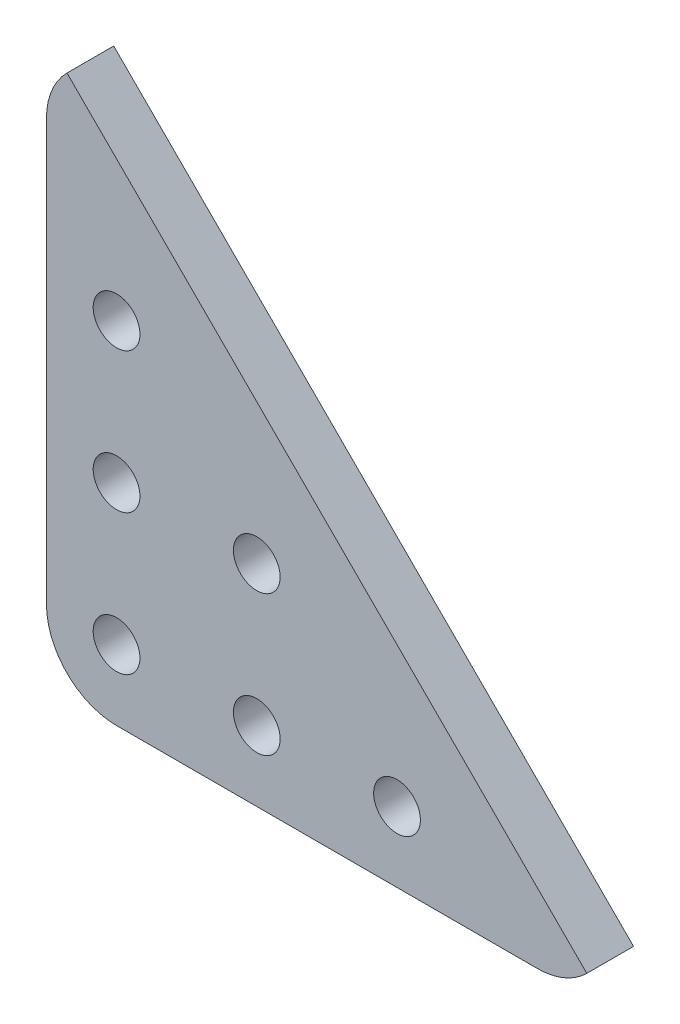
ISO-10303-21;
HEADER;
FILE_DESCRIPTION(('STEP AP214'),'2;1');
FILE_NAME('part.step','',(''),(''),'','','');
FILE_SCHEMA(('AUTOMOTIVE_DESIGN { 1 0 10303 214 1 1 1 1 }'));
ENDSEC;
DATA;
#1=APPLICATION_CONTEXT('core data for automotive mechanical design processes');
#2=APPLICATION_PROTOCOL_DEFINITION('international standard','automotive_design',2000,#1);
#3=PRODUCT_CONTEXT('',#1,'mechanical');
#4=PRODUCT('Part','Part','',(#3));
#5=PRODUCT_RELATED_PRODUCT_CATEGORY('part','',(#4));
#6=PRODUCT_DEFINITION_FORMATION('','',#4);
#7=PRODUCT_DEFINITION_CONTEXT('part definition',#1,'design');
#8=PRODUCT_DEFINITION('design','',#6,#7);
#9=PRODUCT_DEFINITION_SHAPE('','',#8);
#10=(LENGTH_UNIT() NAMED_UNIT(*) SI_UNIT(.MILLI.,.METRE.));
#11=(NAMED_UNIT(*) PLANE_ANGLE_UNIT() SI_UNIT($,.RADIAN.));
#12=(NAMED_UNIT(*) SI_UNIT($,.STERADIAN.) SOLID_ANGLE_UNIT());
#13=UNCERTAINTY_MEASURE_WITH_UNIT(LENGTH_MEASURE(1.E-05),#10,'distance_accuracy_value','');
#14=(GEOMETRIC_REPRESENTATION_CONTEXT(3) GLOBAL_UNCERTAINTY_ASSIGNED_CONTEXT((#13)) GLOBAL_UNIT_ASSIGNED_CONTEXT((#10,
#11,#12)) REPRESENTATION_CONTEXT('',''));
#15=CARTESIAN_POINT('',(0.,0.,0.));
#16=DIRECTION('',(0.,0.,1.));
#17=DIRECTION('',(1.,0.,0.));
#18=AXIS2_PLACEMENT_3D('',#15,#16,#17);
#19=CARTESIAN_POINT('',(-101.443383637,101.056539337921,3.));
#20=DIRECTION('',(0.,0.,1.));
#21=DIRECTION('',(1.,0.,0.));
#22=AXIS2_PLACEMENT_3D('',#19,#20,#21);
#23=PLANE('',#22);
#24=CARTESIAN_POINT('',(-92.443383637,74.056539338,3.));
#25=DIRECTION('',(0.,0.,1.));
#26=DIRECTION('',(1.,0.,0.));
#27=AXIS2_PLACEMENT_3D('',#24,#25,#26);
#28=CIRCLE('',#27,1.5);
#29=CARTESIAN_POINT('',(-90.943383637,74.056539338,3.));
#30=VERTEX_POINT('',#29);
#31=EDGE_CURVE('E198',#30,#30,#28,.T.);
#32=ORIENTED_EDGE('',*,*,#31,.F.);
#33=EDGE_LOOP('',(#32));
#34=FACE_BOUND('',#33,.T.);
#35=CARTESIAN_POINT('',(-92.443383637,83.056539338,3.));
#36=DIRECTION('',(0.,0.,1.));
#37=DIRECTION('',(1.,0.,0.));
#38=AXIS2_PLACEMENT_3D('',#35,#36,#37);
#39=CIRCLE('',#38,1.5);
#40=CARTESIAN_POINT('',(-90.943383637,83.056539338,3.));
#41=VERTEX_POINT('',#40);
#42=EDGE_CURVE('E210',#41,#41,#39,.T.);
#43=ORIENTED_EDGE('',*,*,#42,.F.);
#44=EDGE_LOOP('',(#43));
#45=FACE_BOUND('',#44,.T.);
#46=CARTESIAN_POINT('',(-101.443383637,92.056539338,3.));
#47=DIRECTION('',(0.,0.,1.));
#48=DIRECTION('',(1.,0.,0.));
#49=AXIS2_PLACEMENT_3D('',#46,#47,#48);
#50=CIRCLE('',#49,1.5);
#51=CARTESIAN_POINT('',(-99.943383637,92.056539338,3.));
#52=VERTEX_POINT('',#51);
#53=EDGE_CURVE('E122',#52,#52,#50,.T.);
#54=ORIENTED_EDGE('',*,*,#53,.F.);
#55=EDGE_LOOP('',(#54));
#56=FACE_BOUND('',#55,.T.);
#57=CARTESIAN_POINT('',(-101.443383637,101.056539337921,3.));
#58=DIRECTION('',(0.,0.,1.));
#59=DIRECTION('',(1.,0.,0.));
#60=AXIS2_PLACEMENT_3D('',#57,#58,#59);
#61=CIRCLE('',#60,4.50000000000001);
#62=CARTESIAN_POINT('',(-104.6253641523,104.2385198533,3.));
#63=VERTEX_POINT('',#62);
#64=CARTESIAN_POINT('',(-105.943383637,101.056539338,3.));
#65=VERTEX_POINT('',#64);
#66=EDGE_CURVE('E129',#63,#65,#61,.T.);
#67=ORIENTED_EDGE('',*,*,#66,.T.);
#68=DIRECTION('',(0.,-1.,0.));
#69=VECTOR('',#68,1.);
#70=CARTESIAN_POINT('',(-105.943383637,101.056539338,3.));
#71=LINE('',#70,#69);
#72=CARTESIAN_POINT('',(-105.943383637,74.056539338,3.));
#73=VERTEX_POINT('',#72);
#74=EDGE_CURVE('E87',#65,#73,#71,.T.);
#75=ORIENTED_EDGE('',*,*,#74,.T.);
#76=CARTESIAN_POINT('',(-101.443383637,74.056539338,3.));
#77=DIRECTION('',(0.,0.,1.));
#78=DIRECTION('',(1.,0.,0.));
#79=AXIS2_PLACEMENT_3D('',#76,#77,#78);
#80=CIRCLE('',#79,4.5);
#81=CARTESIAN_POINT('',(-101.443383637,69.556539338,3.));
#82=VERTEX_POINT('',#81);
#83=EDGE_CURVE('E100',#73,#82,#80,.T.);
#84=ORIENTED_EDGE('',*,*,#83,.T.);
#85=DIRECTION('',(1.,0.,0.));
#86=VECTOR('',#85,1.);
#87=CARTESIAN_POINT('',(-101.443383637,69.556539338,3.));
#88=LINE('',#87,#86);
#89=CARTESIAN_POINT('',(-74.443383637,69.556539338,3.));
#90=VERTEX_POINT('',#89);
#91=EDGE_CURVE('E94',#82,#90,#88,.T.);
#92=ORIENTED_EDGE('',*,*,#91,.T.);
#93=CARTESIAN_POINT('',(-74.4433836370789,74.056539338,3.));
#94=DIRECTION('',(0.,0.,1.));
#95=DIRECTION('',(1.,0.,0.));
#96=AXIS2_PLACEMENT_3D('',#93,#94,#95);
#97=CIRCLE('',#96,4.5);
#98=CARTESIAN_POINT('',(-71.2614031217,70.8745588227,3.));
#99=VERTEX_POINT('',#98);
#100=EDGE_CURVE('E98',#90,#99,#97,.T.);
#101=ORIENTED_EDGE('',*,*,#100,.T.);
#102=DIRECTION('',(-0.707106781186547,0.707106781186548,0.));
#103=VECTOR('',#102,1.);
#104=CARTESIAN_POINT('',(-104.6253641523,104.2385198533,3.));
#105=LINE('',#104,#103);
#106=EDGE_CURVE('E50',#99,#63,#105,.T.);
#107=ORIENTED_EDGE('',*,*,#106,.T.);
#108=EDGE_LOOP('',(#67,#75,#84,#92,#101,#107));
#109=FACE_BOUND('',#108,.T.);
#110=CARTESIAN_POINT('',(-101.443383637,83.056539338,3.));
#111=DIRECTION('',(0.,0.,1.));
#112=DIRECTION('',(1.,0.,0.));
#113=AXIS2_PLACEMENT_3D('',#110,#111,#112);
#114=CIRCLE('',#113,1.5);
#115=CARTESIAN_POINT('',(-99.943383637,83.056539338,3.));
#116=VERTEX_POINT('',#115);
#117=EDGE_CURVE('E216',#116,#116,#114,.T.);
#118=ORIENTED_EDGE('',*,*,#117,.F.);
#119=EDGE_LOOP('',(#118));
#120=FACE_BOUND('',#119,.T.);
#121=CARTESIAN_POINT('',(-101.443383637,74.056539338,3.));
#122=DIRECTION('',(0.,0.,1.));
#123=DIRECTION('',(1.,0.,0.));
#124=AXIS2_PLACEMENT_3D('',#121,#122,#123);
#125=CIRCLE('',#124,1.5);
#126=CARTESIAN_POINT('',(-99.943383637,74.056539338,3.));
#127=VERTEX_POINT('',#126);
#128=EDGE_CURVE('E204',#127,#127,#125,.T.);
#129=ORIENTED_EDGE('',*,*,#128,.F.);
#130=EDGE_LOOP('',(#129));
#131=FACE_BOUND('',#130,.T.);
#132=CARTESIAN_POINT('',(-83.443383637,74.056539338,3.));
#133=DIRECTION('',(0.,0.,1.));
#134=DIRECTION('',(1.,0.,0.));
#135=AXIS2_PLACEMENT_3D('',#132,#133,#134);
#136=CIRCLE('',#135,1.5);
#137=CARTESIAN_POINT('',(-81.943383637,74.056539338,3.));
#138=VERTEX_POINT('',#137);
#139=EDGE_CURVE('E189',#138,#138,#136,.T.);
#140=ORIENTED_EDGE('',*,*,#139,.F.);
#141=EDGE_LOOP('',(#140));
#142=FACE_BOUND('',#141,.T.);
#143=ADVANCED_FACE('F33',(#34,#45,#56,#109,#120,#131,#142),#23,.T.);
#144=CARTESIAN_POINT('',(-101.443383637,101.056539337921,0.));
#145=DIRECTION('',(0.,0.,1.));
#146=DIRECTION('',(1.,0.,0.));
#147=AXIS2_PLACEMENT_3D('',#144,#145,#146);
#148=PLANE('',#147);
#149=CARTESIAN_POINT('',(-92.443383637,74.056539338,0.));
#150=DIRECTION('',(0.,0.,1.));
#151=DIRECTION('',(1.,0.,0.));
#152=AXIS2_PLACEMENT_3D('',#149,#150,#151);
#153=CIRCLE('',#152,1.5);
#154=CARTESIAN_POINT('',(-90.943383637,74.056539338,0.));
#155=VERTEX_POINT('',#154);
#156=EDGE_CURVE('E195',#155,#155,#153,.T.);
#157=ORIENTED_EDGE('',*,*,#156,.T.);
#158=EDGE_LOOP('',(#157));
#159=FACE_BOUND('',#158,.T.);
#160=CARTESIAN_POINT('',(-92.443383637,83.056539338,0.));
#161=DIRECTION('',(0.,0.,1.));
#162=DIRECTION('',(1.,0.,0.));
#163=AXIS2_PLACEMENT_3D('',#160,#161,#162);
#164=CIRCLE('',#163,1.5);
#165=CARTESIAN_POINT('',(-90.943383637,83.056539338,0.));
#166=VERTEX_POINT('',#165);
#167=EDGE_CURVE('E207',#166,#166,#164,.T.);
#168=ORIENTED_EDGE('',*,*,#167,.T.);
#169=EDGE_LOOP('',(#168));
#170=FACE_BOUND('',#169,.T.);
#171=CARTESIAN_POINT('',(-101.443383637,92.056539338,0.));
#172=DIRECTION('',(0.,0.,1.));
#173=DIRECTION('',(1.,0.,0.));
#174=AXIS2_PLACEMENT_3D('',#171,#172,#173);
#175=CIRCLE('',#174,1.5);
#176=CARTESIAN_POINT('',(-99.943383637,92.056539338,0.));
#177=VERTEX_POINT('',#176);
#178=EDGE_CURVE('E219',#177,#177,#175,.T.);
#179=ORIENTED_EDGE('',*,*,#178,.T.);
#180=EDGE_LOOP('',(#179));
#181=FACE_BOUND('',#180,.T.);
#182=CARTESIAN_POINT('',(-101.443383637,101.056539337921,0.));
#183=DIRECTION('',(0.,0.,1.));
#184=DIRECTION('',(1.,0.,0.));
#185=AXIS2_PLACEMENT_3D('',#182,#183,#184);
#186=CIRCLE('',#185,4.50000000000001);
#187=CARTESIAN_POINT('',(-104.6253641523,104.2385198533,0.));
#188=VERTEX_POINT('',#187);
#189=CARTESIAN_POINT('',(-105.943383637,101.056539338,0.));
#190=VERTEX_POINT('',#189);
#191=EDGE_CURVE('E118',#188,#190,#186,.T.);
#192=ORIENTED_EDGE('',*,*,#191,.F.);
#193=DIRECTION('',(-0.707106781186547,0.707106781186548,0.));
#194=VECTOR('',#193,1.);
#195=CARTESIAN_POINT('',(-104.6253641523,104.2385198533,0.));
#196=LINE('',#195,#194);
#197=CARTESIAN_POINT('',(-71.2614031217,70.8745588227,0.));
#198=VERTEX_POINT('',#197);
#199=EDGE_CURVE('E79',#198,#188,#196,.T.);
#200=ORIENTED_EDGE('',*,*,#199,.F.);
#201=CARTESIAN_POINT('',(-74.4433836370789,74.056539338,0.));
#202=DIRECTION('',(0.,0.,1.));
#203=DIRECTION('',(1.,0.,0.));
#204=AXIS2_PLACEMENT_3D('',#201,#202,#203);
#205=CIRCLE('',#204,4.5);
#206=CARTESIAN_POINT('',(-74.443383637,69.556539338,0.));
#207=VERTEX_POINT('',#206);
#208=EDGE_CURVE('E73',#207,#198,#205,.T.);
#209=ORIENTED_EDGE('',*,*,#208,.F.);
#210=DIRECTION('',(1.,0.,0.));
#211=VECTOR('',#210,1.);
#212=CARTESIAN_POINT('',(-101.443383637,69.556539338,0.));
#213=LINE('',#212,#211);
#214=CARTESIAN_POINT('',(-101.443383637,69.556539338,0.));
#215=VERTEX_POINT('',#214);
#216=EDGE_CURVE('E108',#215,#207,#213,.T.);
#217=ORIENTED_EDGE('',*,*,#216,.F.);
#218=CARTESIAN_POINT('',(-101.443383637,74.056539338,0.));
#219=DIRECTION('',(0.,0.,1.));
#220=DIRECTION('',(1.,0.,0.));
#221=AXIS2_PLACEMENT_3D('',#218,#219,#220);
#222=CIRCLE('',#221,4.5);
#223=CARTESIAN_POINT('',(-105.943383637,74.056539338,0.));
#224=VERTEX_POINT('',#223);
#225=EDGE_CURVE('E124',#224,#215,#222,.T.);
#226=ORIENTED_EDGE('',*,*,#225,.F.);
#227=DIRECTION('',(0.,-1.,0.));
#228=VECTOR('',#227,1.);
#229=CARTESIAN_POINT('',(-105.943383637,101.056539338,0.));
#230=LINE('',#229,#228);
#231=EDGE_CURVE('E121',#190,#224,#230,.T.);
#232=ORIENTED_EDGE('',*,*,#231,.F.);
#233=EDGE_LOOP('',(#192,#200,#209,#217,#226,#232));
#234=FACE_BOUND('',#233,.T.);
#235=CARTESIAN_POINT('',(-101.443383637,83.056539338,0.));
#236=DIRECTION('',(0.,0.,1.));
#237=DIRECTION('',(1.,0.,0.));
#238=AXIS2_PLACEMENT_3D('',#235,#236,#237);
#239=CIRCLE('',#238,1.5);
#240=CARTESIAN_POINT('',(-99.943383637,83.056539338,0.));
#241=VERTEX_POINT('',#240);
#242=EDGE_CURVE('E213',#241,#241,#239,.T.);
#243=ORIENTED_EDGE('',*,*,#242,.T.);
#244=EDGE_LOOP('',(#243));
#245=FACE_BOUND('',#244,.T.);
#246=CARTESIAN_POINT('',(-101.443383637,74.056539338,0.));
#247=DIRECTION('',(0.,0.,1.));
#248=DIRECTION('',(1.,0.,0.));
#249=AXIS2_PLACEMENT_3D('',#246,#247,#248);
#250=CIRCLE('',#249,1.5);
#251=CARTESIAN_POINT('',(-99.943383637,74.056539338,0.));
#252=VERTEX_POINT('',#251);
#253=EDGE_CURVE('E201',#252,#252,#250,.T.);
#254=ORIENTED_EDGE('',*,*,#253,.T.);
#255=EDGE_LOOP('',(#254));
#256=FACE_BOUND('',#255,.T.);
#257=CARTESIAN_POINT('',(-83.443383637,74.056539338,0.));
#258=DIRECTION('',(0.,0.,1.));
#259=DIRECTION('',(1.,0.,0.));
#260=AXIS2_PLACEMENT_3D('',#257,#258,#259);
#261=CIRCLE('',#260,1.5);
#262=CARTESIAN_POINT('',(-81.943383637,74.056539338,0.));
#263=VERTEX_POINT('',#262);
#264=EDGE_CURVE('E192',#263,#263,#261,.T.);
#265=ORIENTED_EDGE('',*,*,#264,.T.);
#266=EDGE_LOOP('',(#265));
#267=FACE_BOUND('',#266,.T.);
#268=ADVANCED_FACE('F138',(#159,#170,#181,#234,#245,#256,#267),#148,.F.);
#269=CARTESIAN_POINT('',(-101.443383637,101.056539337921,3.));
#270=DIRECTION('',(0.,0.,-1.));
#271=DIRECTION('',(-1.,0.,0.));
#272=AXIS2_PLACEMENT_3D('',#269,#270,#271);
#273=CYLINDRICAL_SURFACE('',#272,4.50000000000001);
#274=ORIENTED_EDGE('',*,*,#191,.T.);
#275=DIRECTION('',(0.,0.,-1.));
#276=VECTOR('',#275,1.);
#277=CARTESIAN_POINT('',(-105.943383637,101.056539338,3.));
#278=LINE('',#277,#276);
#279=EDGE_CURVE('E11',#65,#190,#278,.T.);
#280=ORIENTED_EDGE('',*,*,#279,.F.);
#281=ORIENTED_EDGE('',*,*,#66,.F.);
#282=DIRECTION('',(0.,0.,-1.));
#283=VECTOR('',#282,1.);
#284=CARTESIAN_POINT('',(-104.6253641523,104.2385198533,3.));
#285=LINE('',#284,#283);
#286=EDGE_CURVE('E114',#63,#188,#285,.T.);
#287=ORIENTED_EDGE('',*,*,#286,.T.);
#288=EDGE_LOOP('',(#274,#280,#281,#287));
#289=FACE_BOUND('',#288,.T.);
#290=ADVANCED_FACE('F35',(#289),#273,.T.);
#291=CARTESIAN_POINT('',(-105.943383637,101.056539338,3.));
#292=DIRECTION('',(1.,0.,0.));
#293=DIRECTION('',(0.,0.,-1.));
#294=AXIS2_PLACEMENT_3D('',#291,#292,#293);
#295=PLANE('',#294);
#296=ORIENTED_EDGE('',*,*,#231,.T.);
#297=DIRECTION('',(0.,0.,-1.));
#298=VECTOR('',#297,1.);
#299=CARTESIAN_POINT('',(-105.943383637,74.056539338,3.));
#300=LINE('',#299,#298);
#301=EDGE_CURVE('E42',#73,#224,#300,.T.);
#302=ORIENTED_EDGE('',*,*,#301,.F.);
#303=ORIENTED_EDGE('',*,*,#74,.F.);
#304=ORIENTED_EDGE('',*,*,#279,.T.);
#305=EDGE_LOOP('',(#296,#302,#303,#304));
#306=FACE_BOUND('',#305,.T.);
#307=ADVANCED_FACE('F294',(#306),#295,.F.);
#308=CARTESIAN_POINT('',(-101.443383637,74.056539338,3.));
#309=DIRECTION('',(0.,0.,-1.));
#310=DIRECTION('',(-1.,0.,0.));
#311=AXIS2_PLACEMENT_3D('',#308,#309,#310);
#312=CYLINDRICAL_SURFACE('',#311,4.5);
#313=ORIENTED_EDGE('',*,*,#225,.T.);
#314=DIRECTION('',(0.,0.,-1.));
#315=VECTOR('',#314,1.);
#316=CARTESIAN_POINT('',(-101.443383637,69.556539338,3.));
#317=LINE('',#316,#315);
#318=EDGE_CURVE('E109',#82,#215,#317,.T.);
#319=ORIENTED_EDGE('',*,*,#318,.F.);
#320=ORIENTED_EDGE('',*,*,#83,.F.);
#321=ORIENTED_EDGE('',*,*,#301,.T.);
#322=EDGE_LOOP('',(#313,#319,#320,#321));
#323=FACE_BOUND('',#322,.T.);
#324=ADVANCED_FACE('F135',(#323),#312,.T.);
#325=CARTESIAN_POINT('',(-101.443383637,69.556539338,3.));
#326=DIRECTION('',(0.,1.,0.));
#327=DIRECTION('',(0.,0.,1.));
#328=AXIS2_PLACEMENT_3D('',#325,#326,#327);
#329=PLANE('',#328);
#330=ORIENTED_EDGE('',*,*,#216,.T.);
#331=DIRECTION('',(0.,0.,-1.));
#332=VECTOR('',#331,1.);
#333=CARTESIAN_POINT('',(-74.443383637,69.556539338,3.));
#334=LINE('',#333,#332);
#335=EDGE_CURVE('E105',#90,#207,#334,.T.);
#336=ORIENTED_EDGE('',*,*,#335,.F.);
#337=ORIENTED_EDGE('',*,*,#91,.F.);
#338=ORIENTED_EDGE('',*,*,#318,.T.);
#339=EDGE_LOOP('',(#330,#336,#337,#338));
#340=FACE_BOUND('',#339,.T.);
#341=ADVANCED_FACE('F106',(#340),#329,.F.);
#342=CARTESIAN_POINT('',(-74.4433836370789,74.056539338,3.));
#343=DIRECTION('',(0.,0.,-1.));
#344=DIRECTION('',(-1.,0.,0.));
#345=AXIS2_PLACEMENT_3D('',#342,#343,#344);
#346=CYLINDRICAL_SURFACE('',#345,4.5);
#347=ORIENTED_EDGE('',*,*,#208,.T.);
#348=DIRECTION('',(0.,0.,-1.));
#349=VECTOR('',#348,1.);
#350=CARTESIAN_POINT('',(-71.2614031217,70.8745588227,3.));
#351=LINE('',#350,#349);
#352=EDGE_CURVE('E110',#99,#198,#351,.T.);
#353=ORIENTED_EDGE('',*,*,#352,.F.);
#354=ORIENTED_EDGE('',*,*,#100,.F.);
#355=ORIENTED_EDGE('',*,*,#335,.T.);
#356=EDGE_LOOP('',(#347,#353,#354,#355));
#357=FACE_BOUND('',#356,.T.);
#358=ADVANCED_FACE('F112',(#357),#346,.T.);
#359=CARTESIAN_POINT('',(-104.6253641523,104.2385198533,3.));
#360=DIRECTION('',(-0.707106781186548,-0.707106781186547,0.));
#361=DIRECTION('',(0.707106781186547,-0.707106781186548,0.));
#362=AXIS2_PLACEMENT_3D('',#359,#360,#361);
#363=PLANE('',#362);
#364=ORIENTED_EDGE('',*,*,#199,.T.);
#365=ORIENTED_EDGE('',*,*,#286,.F.);
#366=ORIENTED_EDGE('',*,*,#106,.F.);
#367=ORIENTED_EDGE('',*,*,#352,.T.);
#368=EDGE_LOOP('',(#364,#365,#366,#367));
#369=FACE_BOUND('',#368,.T.);
#370=ADVANCED_FACE('F143',(#369),#363,.F.);
#371=CARTESIAN_POINT('',(-101.443383637,92.056539338,3.));
#372=DIRECTION('',(0.,0.,-1.));
#373=DIRECTION('',(-1.,0.,0.));
#374=AXIS2_PLACEMENT_3D('',#371,#372,#373);
#375=CYLINDRICAL_SURFACE('',#374,1.5);
#376=ORIENTED_EDGE('',*,*,#53,.T.);
#377=EDGE_LOOP('',(#376));
#378=FACE_BOUND('',#377,.T.);
#379=ORIENTED_EDGE('',*,*,#178,.F.);
#380=EDGE_LOOP('',(#379));
#381=FACE_BOUND('',#380,.T.);
#382=ADVANCED_FACE('F145',(#378,#381),#375,.F.);
#383=CARTESIAN_POINT('',(-101.443383637,83.056539338,3.));
#384=DIRECTION('',(0.,0.,-1.));
#385=DIRECTION('',(-1.,0.,0.));
#386=AXIS2_PLACEMENT_3D('',#383,#384,#385);
#387=CYLINDRICAL_SURFACE('',#386,1.5);
#388=ORIENTED_EDGE('',*,*,#117,.T.);
#389=EDGE_LOOP('',(#388));
#390=FACE_BOUND('',#389,.T.);
#391=ORIENTED_EDGE('',*,*,#242,.F.);
#392=EDGE_LOOP('',(#391));
#393=FACE_BOUND('',#392,.T.);
#394=ADVANCED_FACE('F151',(#390,#393),#387,.F.);
#395=CARTESIAN_POINT('',(-92.443383637,83.056539338,3.));
#396=DIRECTION('',(0.,0.,-1.));
#397=DIRECTION('',(-1.,0.,0.));
#398=AXIS2_PLACEMENT_3D('',#395,#396,#397);
#399=CYLINDRICAL_SURFACE('',#398,1.5);
#400=ORIENTED_EDGE('',*,*,#42,.T.);
#401=EDGE_LOOP('',(#400));
#402=FACE_BOUND('',#401,.T.);
#403=ORIENTED_EDGE('',*,*,#167,.F.);
#404=EDGE_LOOP('',(#403));
#405=FACE_BOUND('',#404,.T.);
#406=ADVANCED_FACE('F168',(#402,#405),#399,.F.);
#407=CARTESIAN_POINT('',(-101.443383637,74.056539338,3.));
#408=DIRECTION('',(0.,0.,-1.));
#409=DIRECTION('',(-1.,0.,0.));
#410=AXIS2_PLACEMENT_3D('',#407,#408,#409);
#411=CYLINDRICAL_SURFACE('',#410,1.5);
#412=ORIENTED_EDGE('',*,*,#128,.T.);
#413=EDGE_LOOP('',(#412));
#414=FACE_BOUND('',#413,.T.);
#415=ORIENTED_EDGE('',*,*,#253,.F.);
#416=EDGE_LOOP('',(#415));
#417=FACE_BOUND('',#416,.T.);
#418=ADVANCED_FACE('F172',(#414,#417),#411,.F.);
#419=CARTESIAN_POINT('',(-92.443383637,74.056539338,3.));
#420=DIRECTION('',(0.,0.,-1.));
#421=DIRECTION('',(-1.,0.,0.));
#422=AXIS2_PLACEMENT_3D('',#419,#420,#421);
#423=CYLINDRICAL_SURFACE('',#422,1.5);
#424=ORIENTED_EDGE('',*,*,#31,.T.);
#425=EDGE_LOOP('',(#424));
#426=FACE_BOUND('',#425,.T.);
#427=ORIENTED_EDGE('',*,*,#156,.F.);
#428=EDGE_LOOP('',(#427));
#429=FACE_BOUND('',#428,.T.);
#430=ADVANCED_FACE('F176',(#426,#429),#423,.F.);
#431=CARTESIAN_POINT('',(-83.443383637,74.056539338,3.));
#432=DIRECTION('',(0.,0.,-1.));
#433=DIRECTION('',(-1.,0.,0.));
#434=AXIS2_PLACEMENT_3D('',#431,#432,#433);
#435=CYLINDRICAL_SURFACE('',#434,1.5);
#436=ORIENTED_EDGE('',*,*,#139,.T.);
#437=EDGE_LOOP('',(#436));
#438=FACE_BOUND('',#437,.T.);
#439=ORIENTED_EDGE('',*,*,#264,.F.);
#440=EDGE_LOOP('',(#439));
#441=FACE_BOUND('',#440,.T.);
#442=ADVANCED_FACE('F180',(#438,#441),#435,.F.);
#443=CLOSED_SHELL('',(#143,#268,#290,#307,#324,#341,#358,#370,#382,#394,#406,#418,#430,#442));
#444=MANIFOLD_SOLID_BREP('B2',#443);
#445=ADVANCED_BREP_SHAPE_REPRESENTATION('',(#18,#444),#14);
#446=SHAPE_DEFINITION_REPRESENTATION(#9,#445);
ENDSEC;
END-ISO-10303-21;
